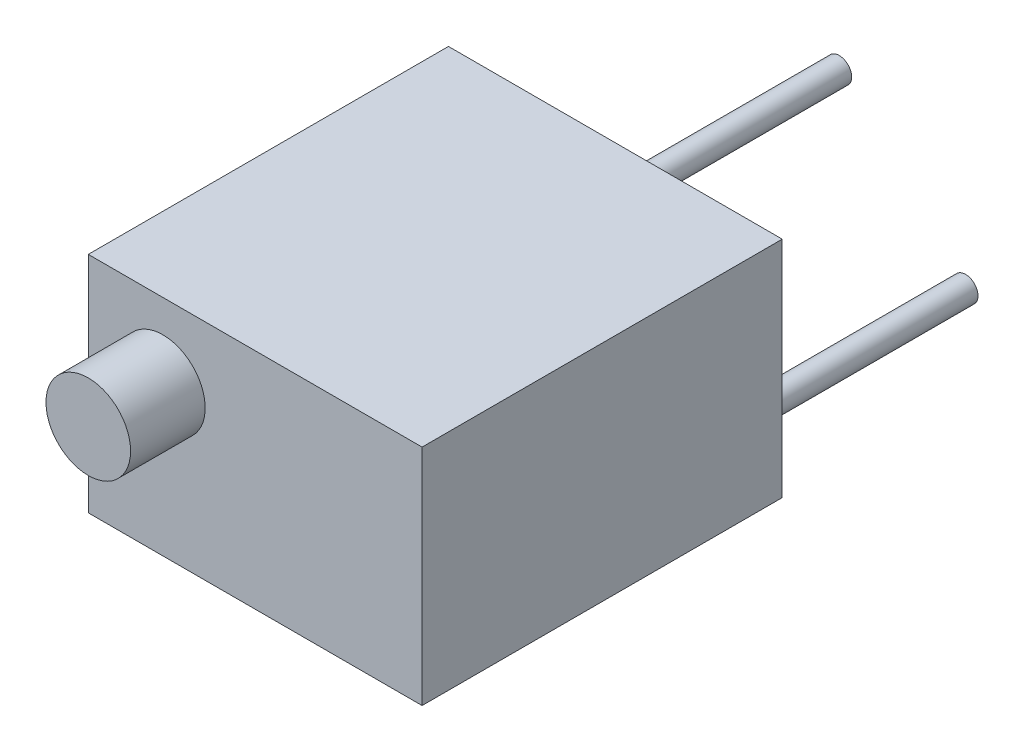
ISO-10303-21;
HEADER;
FILE_DESCRIPTION(('STEP AP214'),'2;1');
FILE_NAME('part.step','',(''),(''),'','','');
FILE_SCHEMA(('AUTOMOTIVE_DESIGN { 1 0 10303 214 1 1 1 1 }'));
ENDSEC;
DATA;
#1=APPLICATION_CONTEXT('core data for automotive mechanical design processes');
#2=APPLICATION_PROTOCOL_DEFINITION('international standard','automotive_design',2000,#1);
#3=PRODUCT_CONTEXT('',#1,'mechanical');
#4=PRODUCT('Part','Part','',(#3));
#5=PRODUCT_RELATED_PRODUCT_CATEGORY('part','',(#4));
#6=PRODUCT_DEFINITION_FORMATION('','',#4);
#7=PRODUCT_DEFINITION_CONTEXT('part definition',#1,'design');
#8=PRODUCT_DEFINITION('design','',#6,#7);
#9=PRODUCT_DEFINITION_SHAPE('','',#8);
#10=(LENGTH_UNIT() NAMED_UNIT(*) SI_UNIT(.MILLI.,.METRE.));
#11=(NAMED_UNIT(*) PLANE_ANGLE_UNIT() SI_UNIT($,.RADIAN.));
#12=(NAMED_UNIT(*) SI_UNIT($,.STERADIAN.) SOLID_ANGLE_UNIT());
#13=UNCERTAINTY_MEASURE_WITH_UNIT(LENGTH_MEASURE(1.E-05),#10,'distance_accuracy_value','');
#14=(GEOMETRIC_REPRESENTATION_CONTEXT(3) GLOBAL_UNCERTAINTY_ASSIGNED_CONTEXT((#13)) GLOBAL_UNIT_ASSIGNED_CONTEXT((#10,
#11,#12)) REPRESENTATION_CONTEXT('',''));
#15=CARTESIAN_POINT('',(0.,0.,0.));
#16=DIRECTION('',(0.,0.,1.));
#17=DIRECTION('',(1.,0.,0.));
#18=AXIS2_PLACEMENT_3D('',#15,#16,#17);
#19=CARTESIAN_POINT('',(-3.355,2.25,3.61999999999999));
#20=DIRECTION('',(0.,0.,-1.));
#21=DIRECTION('',(-1.,0.,0.));
#22=AXIS2_PLACEMENT_3D('',#19,#20,#21);
#23=PLANE('',#22);
#24=DIRECTION('',(0.,-1.,0.));
#25=VECTOR('',#24,1.);
#26=CARTESIAN_POINT('',(-3.355,2.25,3.61999999999999));
#27=LINE('',#26,#25);
#28=CARTESIAN_POINT('',(-3.355,2.25,3.61999999999999));
#29=VERTEX_POINT('',#28);
#30=CARTESIAN_POINT('',(-3.355,-2.25,3.61999999999999));
#31=VERTEX_POINT('',#30);
#32=EDGE_CURVE('E76',#29,#31,#27,.T.);
#33=ORIENTED_EDGE('',*,*,#32,.T.);
#34=DIRECTION('',(1.,0.,0.));
#35=VECTOR('',#34,1.);
#36=CARTESIAN_POINT('',(-3.355,-2.25,3.61999999999999));
#37=LINE('',#36,#35);
#38=CARTESIAN_POINT('',(3.35500000000002,-2.25,3.61999999999999));
#39=VERTEX_POINT('',#38);
#40=EDGE_CURVE('E80',#31,#39,#37,.T.);
#41=ORIENTED_EDGE('',*,*,#40,.T.);
#42=DIRECTION('',(0.,-1.,0.));
#43=VECTOR('',#42,1.);
#44=CARTESIAN_POINT('',(3.35500000000002,2.25,3.61999999999999));
#45=LINE('',#44,#43);
#46=CARTESIAN_POINT('',(3.35500000000002,2.25,3.61999999999999));
#47=VERTEX_POINT('',#46);
#48=EDGE_CURVE('E86',#47,#39,#45,.T.);
#49=ORIENTED_EDGE('',*,*,#48,.F.);
#50=DIRECTION('',(1.,0.,0.));
#51=VECTOR('',#50,1.);
#52=CARTESIAN_POINT('',(-3.355,2.25,3.61999999999999));
#53=LINE('',#52,#51);
#54=EDGE_CURVE('E81',#29,#47,#53,.T.);
#55=ORIENTED_EDGE('',*,*,#54,.F.);
#56=EDGE_LOOP('',(#33,#41,#49,#55));
#57=FACE_BOUND('',#56,.T.);
#58=CARTESIAN_POINT('',(-1.855,0.75,3.61999999999999));
#59=DIRECTION('',(0.,0.,-1.));
#60=DIRECTION('',(-1.,0.,0.));
#61=AXIS2_PLACEMENT_3D('',#58,#59,#60);
#62=CIRCLE('',#61,0.85);
#63=CARTESIAN_POINT('',(-2.705,0.75,3.61999999999999));
#64=VERTEX_POINT('',#63);
#65=EDGE_CURVE('E11',#64,#64,#62,.F.);
#66=ORIENTED_EDGE('',*,*,#65,.F.);
#67=EDGE_LOOP('',(#66));
#68=FACE_BOUND('',#67,.T.);
#69=ADVANCED_FACE('F35',(#57,#68),#23,.F.);
#70=CARTESIAN_POINT('',(-3.355,2.25,-3.62));
#71=DIRECTION('',(0.,0.,1.));
#72=DIRECTION('',(1.,0.,0.));
#73=AXIS2_PLACEMENT_3D('',#70,#71,#72);
#74=PLANE('',#73);
#75=CARTESIAN_POINT('',(-2.54,-1.27,-3.62));
#76=DIRECTION('',(0.,0.,1.));
#77=DIRECTION('',(1.,0.,0.));
#78=AXIS2_PLACEMENT_3D('',#75,#76,#77);
#79=CIRCLE('',#78,0.25);
#80=CARTESIAN_POINT('',(-2.29,-1.27,-3.62));
#81=VERTEX_POINT('',#80);
#82=EDGE_CURVE('E120',#81,#81,#79,.F.);
#83=ORIENTED_EDGE('',*,*,#82,.F.);
#84=EDGE_LOOP('',(#83));
#85=FACE_BOUND('',#84,.T.);
#86=DIRECTION('',(0.,-1.,0.));
#87=VECTOR('',#86,1.);
#88=CARTESIAN_POINT('',(3.355,2.25,-3.62000000000001));
#89=LINE('',#88,#87);
#90=CARTESIAN_POINT('',(3.355,2.25,-3.62000000000001));
#91=VERTEX_POINT('',#90);
#92=CARTESIAN_POINT('',(3.355,-2.25,-3.62000000000001));
#93=VERTEX_POINT('',#92);
#94=EDGE_CURVE('E115',#91,#93,#89,.T.);
#95=ORIENTED_EDGE('',*,*,#94,.T.);
#96=DIRECTION('',(-1.,0.,0.));
#97=VECTOR('',#96,1.);
#98=CARTESIAN_POINT('',(-3.355,-2.25,-3.62));
#99=LINE('',#98,#97);
#100=CARTESIAN_POINT('',(-3.355,-2.25,-3.62));
#101=VERTEX_POINT('',#100);
#102=EDGE_CURVE('E107',#93,#101,#99,.T.);
#103=ORIENTED_EDGE('',*,*,#102,.T.);
#104=DIRECTION('',(0.,-1.,0.));
#105=VECTOR('',#104,1.);
#106=CARTESIAN_POINT('',(-3.355,2.25,-3.62));
#107=LINE('',#106,#105);
#108=CARTESIAN_POINT('',(-3.355,2.25,-3.62));
#109=VERTEX_POINT('',#108);
#110=EDGE_CURVE('E98',#109,#101,#107,.T.);
#111=ORIENTED_EDGE('',*,*,#110,.F.);
#112=DIRECTION('',(-1.,0.,0.));
#113=VECTOR('',#112,1.);
#114=CARTESIAN_POINT('',(-3.355,2.25,-3.62));
#115=LINE('',#114,#113);
#116=EDGE_CURVE('E50',#91,#109,#115,.T.);
#117=ORIENTED_EDGE('',*,*,#116,.F.);
#118=EDGE_LOOP('',(#95,#103,#111,#117));
#119=FACE_BOUND('',#118,.T.);
#120=CARTESIAN_POINT('',(0.,1.27,-3.62));
#121=DIRECTION('',(0.,0.,1.));
#122=DIRECTION('',(1.,0.,0.));
#123=AXIS2_PLACEMENT_3D('',#120,#121,#122);
#124=CIRCLE('',#123,0.25);
#125=CARTESIAN_POINT('',(0.249999999999999,1.27,-3.62));
#126=VERTEX_POINT('',#125);
#127=EDGE_CURVE('E85',#126,#126,#124,.F.);
#128=ORIENTED_EDGE('',*,*,#127,.F.);
#129=EDGE_LOOP('',(#128));
#130=FACE_BOUND('',#129,.T.);
#131=CARTESIAN_POINT('',(2.54,-1.27,-3.62000000000001));
#132=DIRECTION('',(0.,0.,1.));
#133=DIRECTION('',(1.,0.,0.));
#134=AXIS2_PLACEMENT_3D('',#131,#132,#133);
#135=CIRCLE('',#134,0.25);
#136=CARTESIAN_POINT('',(2.79,-1.27,-3.62000000000001));
#137=VERTEX_POINT('',#136);
#138=EDGE_CURVE('E43',#137,#137,#135,.F.);
#139=ORIENTED_EDGE('',*,*,#138,.F.);
#140=EDGE_LOOP('',(#139));
#141=FACE_BOUND('',#140,.T.);
#142=ADVANCED_FACE('F127',(#85,#119,#130,#141),#74,.F.);
#143=CARTESIAN_POINT('',(-3.355,2.25,-3.62));
#144=DIRECTION('',(1.,0.,0.));
#145=DIRECTION('',(0.,0.,-1.));
#146=AXIS2_PLACEMENT_3D('',#143,#144,#145);
#147=PLANE('',#146);
#148=ORIENTED_EDGE('',*,*,#110,.T.);
#149=DIRECTION('',(0.,0.,1.));
#150=VECTOR('',#149,1.);
#151=CARTESIAN_POINT('',(-3.355,-2.25,-3.62));
#152=LINE('',#151,#150);
#153=EDGE_CURVE('E93',#101,#31,#152,.T.);
#154=ORIENTED_EDGE('',*,*,#153,.T.);
#155=ORIENTED_EDGE('',*,*,#32,.F.);
#156=DIRECTION('',(0.,0.,1.));
#157=VECTOR('',#156,1.);
#158=CARTESIAN_POINT('',(-3.355,2.25,-3.62));
#159=LINE('',#158,#157);
#160=EDGE_CURVE('E109',#109,#29,#159,.T.);
#161=ORIENTED_EDGE('',*,*,#160,.F.);
#162=EDGE_LOOP('',(#148,#154,#155,#161));
#163=FACE_BOUND('',#162,.T.);
#164=ADVANCED_FACE('F37',(#163),#147,.F.);
#165=CARTESIAN_POINT('',(3.355,2.25,-3.62000000000001));
#166=DIRECTION('',(-1.,0.,0.));
#167=DIRECTION('',(0.,0.,1.));
#168=AXIS2_PLACEMENT_3D('',#165,#166,#167);
#169=PLANE('',#168);
#170=ORIENTED_EDGE('',*,*,#48,.T.);
#171=DIRECTION('',(0.,0.,-1.));
#172=VECTOR('',#171,1.);
#173=CARTESIAN_POINT('',(3.355,-2.25,-3.62000000000001));
#174=LINE('',#173,#172);
#175=EDGE_CURVE('E96',#39,#93,#174,.T.);
#176=ORIENTED_EDGE('',*,*,#175,.T.);
#177=ORIENTED_EDGE('',*,*,#94,.F.);
#178=DIRECTION('',(0.,0.,-1.));
#179=VECTOR('',#178,1.);
#180=CARTESIAN_POINT('',(3.355,2.25,-3.62000000000001));
#181=LINE('',#180,#179);
#182=EDGE_CURVE('E55',#47,#91,#181,.T.);
#183=ORIENTED_EDGE('',*,*,#182,.F.);
#184=EDGE_LOOP('',(#170,#176,#177,#183));
#185=FACE_BOUND('',#184,.T.);
#186=ADVANCED_FACE('F135',(#185),#169,.F.);
#187=CARTESIAN_POINT('',(-3.355,2.25,3.61999999999999));
#188=DIRECTION('',(0.,1.,0.));
#189=DIRECTION('',(0.,0.,1.));
#190=AXIS2_PLACEMENT_3D('',#187,#188,#189);
#191=PLANE('',#190);
#192=ORIENTED_EDGE('',*,*,#160,.T.);
#193=ORIENTED_EDGE('',*,*,#54,.T.);
#194=ORIENTED_EDGE('',*,*,#182,.T.);
#195=ORIENTED_EDGE('',*,*,#116,.T.);
#196=EDGE_LOOP('',(#192,#193,#194,#195));
#197=FACE_BOUND('',#196,.T.);
#198=ADVANCED_FACE('F140',(#197),#191,.T.);
#199=CARTESIAN_POINT('',(-3.355,-2.25,3.61999999999999));
#200=DIRECTION('',(0.,1.,0.));
#201=DIRECTION('',(0.,0.,1.));
#202=AXIS2_PLACEMENT_3D('',#199,#200,#201);
#203=PLANE('',#202);
#204=ORIENTED_EDGE('',*,*,#153,.F.);
#205=ORIENTED_EDGE('',*,*,#102,.F.);
#206=ORIENTED_EDGE('',*,*,#175,.F.);
#207=ORIENTED_EDGE('',*,*,#40,.F.);
#208=EDGE_LOOP('',(#204,#205,#206,#207));
#209=FACE_BOUND('',#208,.T.);
#210=ADVANCED_FACE('F91',(#209),#203,.F.);
#211=CARTESIAN_POINT('',(0.,1.27,-8.12000000000001));
#212=DIRECTION('',(0.,0.,1.));
#213=DIRECTION('',(1.,0.,0.));
#214=AXIS2_PLACEMENT_3D('',#211,#212,#213);
#215=CYLINDRICAL_SURFACE('',#214,0.25);
#216=CARTESIAN_POINT('',(0.,1.27,-8.12000000000001));
#217=DIRECTION('',(0.,0.,-1.));
#218=DIRECTION('',(-1.,0.,0.));
#219=AXIS2_PLACEMENT_3D('',#216,#217,#218);
#220=CIRCLE('',#219,0.25);
#221=CARTESIAN_POINT('',(-0.250000000000001,1.27,-8.12000000000001));
#222=VERTEX_POINT('',#221);
#223=EDGE_CURVE('E99',#222,#222,#220,.T.);
#224=ORIENTED_EDGE('',*,*,#223,.F.);
#225=EDGE_LOOP('',(#224));
#226=FACE_BOUND('',#225,.T.);
#227=ORIENTED_EDGE('',*,*,#127,.T.);
#228=EDGE_LOOP('',(#227));
#229=FACE_BOUND('',#228,.T.);
#230=ADVANCED_FACE('F150',(#226,#229),#215,.T.);
#231=CARTESIAN_POINT('',(0.,1.27,-8.12000000000001));
#232=DIRECTION('',(0.,0.,-1.));
#233=DIRECTION('',(-1.,0.,0.));
#234=AXIS2_PLACEMENT_3D('',#231,#232,#233);
#235=PLANE('',#234);
#236=ORIENTED_EDGE('',*,*,#223,.T.);
#237=EDGE_LOOP('',(#236));
#238=FACE_BOUND('',#237,.T.);
#239=ADVANCED_FACE('F152',(#238),#235,.T.);
#240=CARTESIAN_POINT('',(-2.54,-1.27,-8.12000000000001));
#241=DIRECTION('',(0.,0.,1.));
#242=DIRECTION('',(1.,0.,0.));
#243=AXIS2_PLACEMENT_3D('',#240,#241,#242);
#244=CYLINDRICAL_SURFACE('',#243,0.25);
#245=CARTESIAN_POINT('',(-2.54,-1.27,-8.12000000000001));
#246=DIRECTION('',(0.,0.,-1.));
#247=DIRECTION('',(-1.,0.,0.));
#248=AXIS2_PLACEMENT_3D('',#245,#246,#247);
#249=CIRCLE('',#248,0.25);
#250=CARTESIAN_POINT('',(-2.79,-1.27,-8.12000000000001));
#251=VERTEX_POINT('',#250);
#252=EDGE_CURVE('E102',#251,#251,#249,.T.);
#253=ORIENTED_EDGE('',*,*,#252,.F.);
#254=EDGE_LOOP('',(#253));
#255=FACE_BOUND('',#254,.T.);
#256=ORIENTED_EDGE('',*,*,#82,.T.);
#257=EDGE_LOOP('',(#256));
#258=FACE_BOUND('',#257,.T.);
#259=ADVANCED_FACE('F159',(#255,#258),#244,.T.);
#260=CARTESIAN_POINT('',(-2.54,-1.27,-8.12000000000001));
#261=DIRECTION('',(0.,0.,-1.));
#262=DIRECTION('',(-1.,0.,0.));
#263=AXIS2_PLACEMENT_3D('',#260,#261,#262);
#264=PLANE('',#263);
#265=ORIENTED_EDGE('',*,*,#252,.T.);
#266=EDGE_LOOP('',(#265));
#267=FACE_BOUND('',#266,.T.);
#268=ADVANCED_FACE('F166',(#267),#264,.T.);
#269=CARTESIAN_POINT('',(2.54,-1.27,-8.12000000000001));
#270=DIRECTION('',(0.,0.,1.));
#271=DIRECTION('',(1.,0.,0.));
#272=AXIS2_PLACEMENT_3D('',#269,#270,#271);
#273=CYLINDRICAL_SURFACE('',#272,0.25);
#274=CARTESIAN_POINT('',(2.54,-1.27,-8.12000000000001));
#275=DIRECTION('',(0.,0.,-1.));
#276=DIRECTION('',(1.,0.,0.));
#277=AXIS2_PLACEMENT_3D('',#274,#275,#276);
#278=CIRCLE('',#277,0.25);
#279=CARTESIAN_POINT('',(2.79,-1.27,-8.12000000000001));
#280=VERTEX_POINT('',#279);
#281=EDGE_CURVE('E190',#280,#280,#278,.T.);
#282=ORIENTED_EDGE('',*,*,#281,.F.);
#283=EDGE_LOOP('',(#282));
#284=FACE_BOUND('',#283,.T.);
#285=ORIENTED_EDGE('',*,*,#138,.T.);
#286=EDGE_LOOP('',(#285));
#287=FACE_BOUND('',#286,.T.);
#288=ADVANCED_FACE('F125',(#284,#287),#273,.T.);
#289=CARTESIAN_POINT('',(2.54,-1.27,-8.12000000000001));
#290=DIRECTION('',(0.,0.,1.));
#291=DIRECTION('',(1.,0.,0.));
#292=AXIS2_PLACEMENT_3D('',#289,#290,#291);
#293=PLANE('',#292);
#294=ORIENTED_EDGE('',*,*,#281,.T.);
#295=EDGE_LOOP('',(#294));
#296=FACE_BOUND('',#295,.T.);
#297=ADVANCED_FACE('F173',(#296),#293,.F.);
#298=CARTESIAN_POINT('',(-1.855,0.75,5.11999999999999));
#299=DIRECTION('',(0.,0.,-1.));
#300=DIRECTION('',(-1.,0.,0.));
#301=AXIS2_PLACEMENT_3D('',#298,#299,#300);
#302=CYLINDRICAL_SURFACE('',#301,0.85);
#303=CARTESIAN_POINT('',(-1.855,0.75,5.11999999999999));
#304=DIRECTION('',(0.,0.,1.));
#305=DIRECTION('',(1.,0.,0.));
#306=AXIS2_PLACEMENT_3D('',#303,#304,#305);
#307=CIRCLE('',#306,0.85);
#308=CARTESIAN_POINT('',(-1.005,0.75,5.11999999999999));
#309=VERTEX_POINT('',#308);
#310=EDGE_CURVE('E189',#309,#309,#307,.T.);
#311=ORIENTED_EDGE('',*,*,#310,.F.);
#312=EDGE_LOOP('',(#311));
#313=FACE_BOUND('',#312,.T.);
#314=ORIENTED_EDGE('',*,*,#65,.T.);
#315=EDGE_LOOP('',(#314));
#316=FACE_BOUND('',#315,.T.);
#317=ADVANCED_FACE('F177',(#313,#316),#302,.T.);
#318=CARTESIAN_POINT('',(-1.855,0.75,5.11999999999999));
#319=DIRECTION('',(0.,0.,1.));
#320=DIRECTION('',(1.,0.,0.));
#321=AXIS2_PLACEMENT_3D('',#318,#319,#320);
#322=PLANE('',#321);
#323=ORIENTED_EDGE('',*,*,#310,.T.);
#324=EDGE_LOOP('',(#323));
#325=FACE_BOUND('',#324,.T.);
#326=ADVANCED_FACE('F181',(#325),#322,.T.);
#327=CLOSED_SHELL('',(#69,#142,#164,#186,#198,#210,#230,#239,#259,#268,#288,#297,#317,#326));
#328=MANIFOLD_SOLID_BREP('B2',#327);
#329=ADVANCED_BREP_SHAPE_REPRESENTATION('',(#18,#328),#14);
#330=SHAPE_DEFINITION_REPRESENTATION(#9,#329);
ENDSEC;
END-ISO-10303-21;
